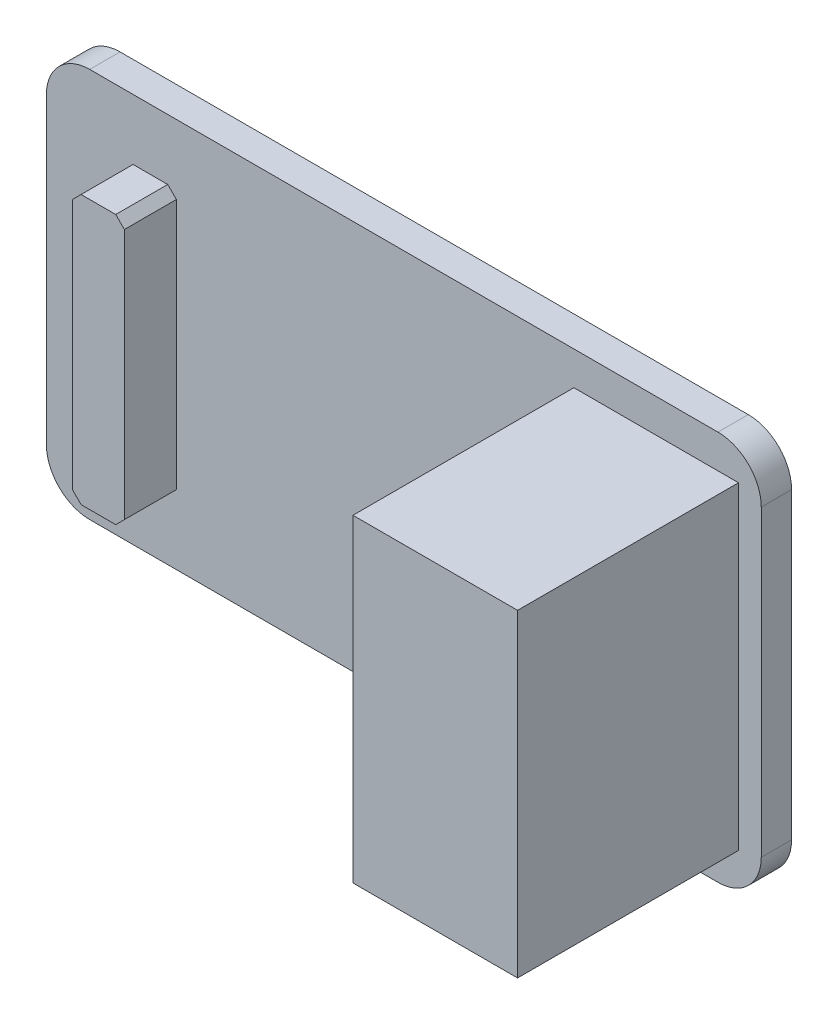
ISO-10303-21;
HEADER;
FILE_DESCRIPTION(('STEP AP214'),'2;1');
FILE_NAME('part.step','',(''),(''),'','','');
FILE_SCHEMA(('AUTOMOTIVE_DESIGN { 1 0 10303 214 1 1 1 1 }'));
ENDSEC;
DATA;
#1=APPLICATION_CONTEXT('core data for automotive mechanical design processes');
#2=APPLICATION_PROTOCOL_DEFINITION('international standard','automotive_design',2000,#1);
#3=PRODUCT_CONTEXT('',#1,'mechanical');
#4=PRODUCT('Part','Part','',(#3));
#5=PRODUCT_RELATED_PRODUCT_CATEGORY('part','',(#4));
#6=PRODUCT_DEFINITION_FORMATION('','',#4);
#7=PRODUCT_DEFINITION_CONTEXT('part definition',#1,'design');
#8=PRODUCT_DEFINITION('design','',#6,#7);
#9=PRODUCT_DEFINITION_SHAPE('','',#8);
#10=(LENGTH_UNIT() NAMED_UNIT(*) SI_UNIT(.MILLI.,.METRE.));
#11=(NAMED_UNIT(*) PLANE_ANGLE_UNIT() SI_UNIT($,.RADIAN.));
#12=(NAMED_UNIT(*) SI_UNIT($,.STERADIAN.) SOLID_ANGLE_UNIT());
#13=UNCERTAINTY_MEASURE_WITH_UNIT(LENGTH_MEASURE(1.E-05),#10,'distance_accuracy_value','');
#14=(GEOMETRIC_REPRESENTATION_CONTEXT(3) GLOBAL_UNCERTAINTY_ASSIGNED_CONTEXT((#13)) GLOBAL_UNIT_ASSIGNED_CONTEXT((#10,
#11,#12)) REPRESENTATION_CONTEXT('',''));
#15=CARTESIAN_POINT('',(0.,0.,0.));
#16=DIRECTION('',(0.,0.,1.));
#17=DIRECTION('',(1.,0.,0.));
#18=AXIS2_PLACEMENT_3D('',#15,#16,#17);
#19=CARTESIAN_POINT('',(2.0000000000002,-52.,0.699999999998851));
#20=DIRECTION('',(5.72375792308882E-13,-5.74263171450686E-13,1.));
#21=DIRECTION('',(1.,0.,-5.72375792308882E-13));
#22=AXIS2_PLACEMENT_3D('',#19,#20,#21);
#23=CYLINDRICAL_SURFACE('',#22,2.00000000000021);
#24=CARTESIAN_POINT('',(2.,-50.,1.4));
#25=CARTESIAN_POINT('',(2.,-50.,0.));
#26=(BOUNDED_CURVE() B_SPLINE_CURVE(1,(#24,#25),.UNSPECIFIED.,.F.,
.F.) B_SPLINE_CURVE_WITH_KNOTS((2,2),(0.,1.4),
.UNSPECIFIED.) CURVE() GEOMETRIC_REPRESENTATION_ITEM() RATIONAL_B_SPLINE_CURVE((1.,1.)) REPRESENTATION_ITEM(''));
#27=CARTESIAN_POINT('',(2.,-50.,1.4));
#28=VERTEX_POINT('',#27);
#29=CARTESIAN_POINT('',(2.,-50.,0.));
#30=VERTEX_POINT('',#29);
#31=EDGE_CURVE('E10',#28,#30,#26,.T.);
#32=ORIENTED_EDGE('',*,*,#31,.T.);
#33=CARTESIAN_POINT('',(2.,-50.,0.));
#34=CARTESIAN_POINT('',(0.,-50.0000000000001,1.14698579168585E-12));
#35=CARTESIAN_POINT('',(0.,-52.,0.));
#36=(BOUNDED_CURVE() B_SPLINE_CURVE(2,(#33,#34,#35),.UNSPECIFIED.,.F.,
.F.) B_SPLINE_CURVE_WITH_KNOTS((3,3),(0.,3.14159265359069),
.UNSPECIFIED.) CURVE() GEOMETRIC_REPRESENTATION_ITEM() RATIONAL_B_SPLINE_CURVE((1.,
0.707106781186604,1.)) REPRESENTATION_ITEM(''));
#37=CARTESIAN_POINT('',(0.,-52.,0.));
#38=VERTEX_POINT('',#37);
#39=EDGE_CURVE('E306',#30,#38,#36,.T.);
#40=ORIENTED_EDGE('',*,*,#39,.T.);
#41=CARTESIAN_POINT('',(0.,-52.,1.4));
#42=CARTESIAN_POINT('',(0.,-52.,0.));
#43=(BOUNDED_CURVE() B_SPLINE_CURVE(1,(#41,#42),.UNSPECIFIED.,.F.,
.F.) B_SPLINE_CURVE_WITH_KNOTS((2,2),(0.,1.4),
.UNSPECIFIED.) CURVE() GEOMETRIC_REPRESENTATION_ITEM() RATIONAL_B_SPLINE_CURVE((1.,1.)) REPRESENTATION_ITEM(''));
#44=CARTESIAN_POINT('',(0.,-52.,1.4));
#45=VERTEX_POINT('',#44);
#46=EDGE_CURVE('E272',#45,#38,#43,.T.);
#47=ORIENTED_EDGE('',*,*,#46,.F.);
#48=CARTESIAN_POINT('',(2.,-50.,1.4));
#49=CARTESIAN_POINT('',(0.,-50.0000000000001,1.40000000000115));
#50=CARTESIAN_POINT('',(0.,-52.,1.4));
#51=(BOUNDED_CURVE() B_SPLINE_CURVE(2,(#48,#49,#50),.UNSPECIFIED.,.F.,
.F.) B_SPLINE_CURVE_WITH_KNOTS((3,3),(0.,3.14159265359069),
.UNSPECIFIED.) CURVE() GEOMETRIC_REPRESENTATION_ITEM() RATIONAL_B_SPLINE_CURVE((1.,
0.707106781186604,1.)) REPRESENTATION_ITEM(''));
#52=EDGE_CURVE('E264',#28,#45,#51,.T.);
#53=ORIENTED_EDGE('',*,*,#52,.F.);
#54=EDGE_LOOP('',(#32,#40,#47,#53));
#55=FACE_BOUND('',#54,.T.);
#56=ADVANCED_FACE('F16',(#55),#23,.T.);
#57=CARTESIAN_POINT('',(31.,-52.,0.699999999998974));
#58=DIRECTION('',(-5.05641515926215E-13,-5.05641515926269E-13,1.));
#59=DIRECTION('',(1.,0.,5.05641515926215E-13));
#60=AXIS2_PLACEMENT_3D('',#57,#58,#59);
#61=CYLINDRICAL_SURFACE('',#60,1.99999999999985);
#62=CARTESIAN_POINT('',(33.,-52.,1.4));
#63=CARTESIAN_POINT('',(33.,-52.,0.));
#64=(BOUNDED_CURVE() B_SPLINE_CURVE(1,(#62,#63),.UNSPECIFIED.,.F.,
.F.) B_SPLINE_CURVE_WITH_KNOTS((2,2),(0.,1.4),
.UNSPECIFIED.) CURVE() GEOMETRIC_REPRESENTATION_ITEM() RATIONAL_B_SPLINE_CURVE((1.,1.)) REPRESENTATION_ITEM(''));
#65=CARTESIAN_POINT('',(33.,-52.,1.4));
#66=VERTEX_POINT('',#65);
#67=CARTESIAN_POINT('',(33.,-52.,0.));
#68=VERTEX_POINT('',#67);
#69=EDGE_CURVE('E296',#66,#68,#64,.T.);
#70=ORIENTED_EDGE('',*,*,#69,.T.);
#71=CARTESIAN_POINT('',(33.,-52.,0.));
#72=CARTESIAN_POINT('',(32.9999999999999,-50.,9.96231667293534E-13));
#73=CARTESIAN_POINT('',(31.,-50.,0.));
#74=(BOUNDED_CURVE() B_SPLINE_CURVE(2,(#71,#72,#73),.UNSPECIFIED.,.F.,
.F.) B_SPLINE_CURVE_WITH_KNOTS((3,3),(0.,3.14159265359029),
.UNSPECIFIED.) CURVE() GEOMETRIC_REPRESENTATION_ITEM() RATIONAL_B_SPLINE_CURVE((1.,
0.707106781186566,1.)) REPRESENTATION_ITEM(''));
#75=CARTESIAN_POINT('',(31.,-50.,0.));
#76=VERTEX_POINT('',#75);
#77=EDGE_CURVE('E305',#68,#76,#74,.T.);
#78=ORIENTED_EDGE('',*,*,#77,.T.);
#79=CARTESIAN_POINT('',(31.,-50.,1.4));
#80=CARTESIAN_POINT('',(31.,-50.,0.));
#81=(BOUNDED_CURVE() B_SPLINE_CURVE(1,(#79,#80),.UNSPECIFIED.,.F.,
.F.) B_SPLINE_CURVE_WITH_KNOTS((2,2),(0.,1.4),
.UNSPECIFIED.) CURVE() GEOMETRIC_REPRESENTATION_ITEM() RATIONAL_B_SPLINE_CURVE((1.,1.)) REPRESENTATION_ITEM(''));
#82=CARTESIAN_POINT('',(31.,-50.,1.4));
#83=VERTEX_POINT('',#82);
#84=EDGE_CURVE('E26',#83,#76,#81,.T.);
#85=ORIENTED_EDGE('',*,*,#84,.F.);
#86=CARTESIAN_POINT('',(33.,-52.,1.4));
#87=CARTESIAN_POINT('',(32.9999999999999,-50.,1.40000000000101));
#88=CARTESIAN_POINT('',(31.,-50.,1.4));
#89=(BOUNDED_CURVE() B_SPLINE_CURVE(2,(#86,#87,#88),.UNSPECIFIED.,.F.,
.F.) B_SPLINE_CURVE_WITH_KNOTS((3,3),(0.,3.14159265359029),
.UNSPECIFIED.) CURVE() GEOMETRIC_REPRESENTATION_ITEM() RATIONAL_B_SPLINE_CURVE((1.,
0.707106781186566,1.)) REPRESENTATION_ITEM(''));
#90=EDGE_CURVE('E435',#66,#83,#89,.T.);
#91=ORIENTED_EDGE('',*,*,#90,.F.);
#92=EDGE_LOOP('',(#70,#78,#85,#91));
#93=FACE_BOUND('',#92,.T.);
#94=ADVANCED_FACE('F771',(#93),#61,.T.);
#95=CARTESIAN_POINT('',(2.00000000000006,-66.,0.7));
#96=DIRECTION('',(0.,0.,-1.));
#97=DIRECTION('',(1.,0.,0.));
#98=AXIS2_PLACEMENT_3D('',#95,#96,#97);
#99=CYLINDRICAL_SURFACE('',#98,2.00000000000006);
#100=CARTESIAN_POINT('',(2.,-68.,0.));
#101=CARTESIAN_POINT('',(2.,-68.,1.4));
#102=(BOUNDED_CURVE() B_SPLINE_CURVE(1,(#100,#101),.UNSPECIFIED.,.F.,
.F.) B_SPLINE_CURVE_WITH_KNOTS((2,2),(0.,1.4),
.UNSPECIFIED.) CURVE() GEOMETRIC_REPRESENTATION_ITEM() RATIONAL_B_SPLINE_CURVE((1.,1.)) REPRESENTATION_ITEM(''));
#103=CARTESIAN_POINT('',(2.,-68.,0.));
#104=VERTEX_POINT('',#103);
#105=CARTESIAN_POINT('',(2.,-68.,1.4));
#106=VERTEX_POINT('',#105);
#107=EDGE_CURVE('E256',#104,#106,#102,.T.);
#108=ORIENTED_EDGE('',*,*,#107,.T.);
#109=CARTESIAN_POINT('',(0.,-66.,1.4));
#110=CARTESIAN_POINT('',(0.,-68.,1.4));
#111=CARTESIAN_POINT('',(2.,-68.,1.4));
#112=(BOUNDED_CURVE() B_SPLINE_CURVE(2,(#109,#110,#111),.UNSPECIFIED.,.F.,
.F.) B_SPLINE_CURVE_WITH_KNOTS((3,3),(-3.14159265359072,0.),
.UNSPECIFIED.) CURVE() GEOMETRIC_REPRESENTATION_ITEM() RATIONAL_B_SPLINE_CURVE((1.,
0.707106781186568,1.)) REPRESENTATION_ITEM(''));
#113=CARTESIAN_POINT('',(0.,-66.,1.4));
#114=VERTEX_POINT('',#113);
#115=EDGE_CURVE('E411',#114,#106,#112,.T.);
#116=ORIENTED_EDGE('',*,*,#115,.F.);
#117=CARTESIAN_POINT('',(0.,-66.,0.));
#118=CARTESIAN_POINT('',(0.,-66.,1.4));
#119=(BOUNDED_CURVE() B_SPLINE_CURVE(1,(#117,#118),.UNSPECIFIED.,.F.,
.F.) B_SPLINE_CURVE_WITH_KNOTS((2,2),(0.,1.4),
.UNSPECIFIED.) CURVE() GEOMETRIC_REPRESENTATION_ITEM() RATIONAL_B_SPLINE_CURVE((1.,1.)) REPRESENTATION_ITEM(''));
#120=CARTESIAN_POINT('',(0.,-66.,0.));
#121=VERTEX_POINT('',#120);
#122=EDGE_CURVE('E347',#121,#114,#119,.T.);
#123=ORIENTED_EDGE('',*,*,#122,.F.);
#124=CARTESIAN_POINT('',(0.,-66.,0.));
#125=CARTESIAN_POINT('',(0.,-68.,0.));
#126=CARTESIAN_POINT('',(2.,-68.,0.));
#127=(BOUNDED_CURVE() B_SPLINE_CURVE(2,(#124,#125,#126),.UNSPECIFIED.,.F.,
.F.) B_SPLINE_CURVE_WITH_KNOTS((3,3),(-3.14159265359072,0.),
.UNSPECIFIED.) CURVE() GEOMETRIC_REPRESENTATION_ITEM() RATIONAL_B_SPLINE_CURVE((1.,
0.707106781186568,1.)) REPRESENTATION_ITEM(''));
#128=EDGE_CURVE('E402',#121,#104,#127,.T.);
#129=ORIENTED_EDGE('',*,*,#128,.T.);
#130=EDGE_LOOP('',(#108,#116,#123,#129));
#131=FACE_BOUND('',#130,.T.);
#132=ADVANCED_FACE('F776',(#131),#99,.T.);
#133=CARTESIAN_POINT('',(31.,-66.,0.700000000002775));
#134=DIRECTION('',(1.38961514147328E-12,-1.38772776233141E-12,1.));
#135=DIRECTION('',(1.,0.,-1.38961514147328E-12));
#136=AXIS2_PLACEMENT_3D('',#133,#134,#135);
#137=CYLINDRICAL_SURFACE('',#136,1.99999999999986);
#138=CARTESIAN_POINT('',(31.,-68.,1.4));
#139=CARTESIAN_POINT('',(31.,-68.,0.));
#140=(BOUNDED_CURVE() B_SPLINE_CURVE(1,(#138,#139),.UNSPECIFIED.,.F.,
.F.) B_SPLINE_CURVE_WITH_KNOTS((2,2),(0.,1.4),
.UNSPECIFIED.) CURVE() GEOMETRIC_REPRESENTATION_ITEM() RATIONAL_B_SPLINE_CURVE((1.,1.)) REPRESENTATION_ITEM(''));
#141=CARTESIAN_POINT('',(31.,-68.,1.4));
#142=VERTEX_POINT('',#141);
#143=CARTESIAN_POINT('',(31.,-68.,0.));
#144=VERTEX_POINT('',#143);
#145=EDGE_CURVE('E131',#142,#144,#140,.T.);
#146=ORIENTED_EDGE('',*,*,#145,.T.);
#147=CARTESIAN_POINT('',(31.,-68.,0.));
#148=CARTESIAN_POINT('',(33.,-68.0000000000001,-2.77447713312269E-12));
#149=CARTESIAN_POINT('',(33.,-66.,0.));
#150=(BOUNDED_CURVE() B_SPLINE_CURVE(2,(#147,#148,#149),.UNSPECIFIED.,.F.,
.F.) B_SPLINE_CURVE_WITH_KNOTS((3,3),(0.,3.14159265359098),
.UNSPECIFIED.) CURVE() GEOMETRIC_REPRESENTATION_ITEM() RATIONAL_B_SPLINE_CURVE((1.,
0.707106781186539,1.)) REPRESENTATION_ITEM(''));
#151=CARTESIAN_POINT('',(33.,-66.,0.));
#152=VERTEX_POINT('',#151);
#153=EDGE_CURVE('E379',#144,#152,#150,.T.);
#154=ORIENTED_EDGE('',*,*,#153,.T.);
#155=CARTESIAN_POINT('',(33.,-66.,1.4));
#156=CARTESIAN_POINT('',(33.,-66.,0.));
#157=(BOUNDED_CURVE() B_SPLINE_CURVE(1,(#155,#156),.UNSPECIFIED.,.F.,
.F.) B_SPLINE_CURVE_WITH_KNOTS((2,2),(0.,1.4),
.UNSPECIFIED.) CURVE() GEOMETRIC_REPRESENTATION_ITEM() RATIONAL_B_SPLINE_CURVE((1.,1.)) REPRESENTATION_ITEM(''));
#158=CARTESIAN_POINT('',(33.,-66.,1.4));
#159=VERTEX_POINT('',#158);
#160=EDGE_CURVE('E141',#159,#152,#157,.T.);
#161=ORIENTED_EDGE('',*,*,#160,.F.);
#162=CARTESIAN_POINT('',(31.,-68.,1.4));
#163=CARTESIAN_POINT('',(33.,-68.,1.39999999999722));
#164=CARTESIAN_POINT('',(33.,-66.,1.4));
#165=(BOUNDED_CURVE() B_SPLINE_CURVE(2,(#162,#163,#164),.UNSPECIFIED.,.F.,
.F.) B_SPLINE_CURVE_WITH_KNOTS((3,3),(0.,3.14159265359098),
.UNSPECIFIED.) CURVE() GEOMETRIC_REPRESENTATION_ITEM() RATIONAL_B_SPLINE_CURVE((1.,
0.707106781186537,1.)) REPRESENTATION_ITEM(''));
#166=EDGE_CURVE('E322',#142,#159,#165,.T.);
#167=ORIENTED_EDGE('',*,*,#166,.F.);
#168=EDGE_LOOP('',(#146,#154,#161,#167));
#169=FACE_BOUND('',#168,.T.);
#170=ADVANCED_FACE('F810',(#169),#137,.T.);
#171=CARTESIAN_POINT('',(33.,-50.,0.));
#172=DIRECTION('',(0.,1.,0.));
#173=DIRECTION('',(1.,0.,0.));
#174=AXIS2_PLACEMENT_3D('',#171,#172,#173);
#175=PLANE('',#174);
#176=ORIENTED_EDGE('',*,*,#84,.T.);
#177=CARTESIAN_POINT('',(31.,-50.,0.));
#178=CARTESIAN_POINT('',(2.,-50.,0.));
#179=(BOUNDED_CURVE() B_SPLINE_CURVE(1,(#177,#178),.UNSPECIFIED.,.F.,
.F.) B_SPLINE_CURVE_WITH_KNOTS((2,2),(53.,82.),
.UNSPECIFIED.) CURVE() GEOMETRIC_REPRESENTATION_ITEM() RATIONAL_B_SPLINE_CURVE((1.,1.)) REPRESENTATION_ITEM(''));
#180=EDGE_CURVE('E297',#76,#30,#179,.T.);
#181=ORIENTED_EDGE('',*,*,#180,.T.);
#182=ORIENTED_EDGE('',*,*,#31,.F.);
#183=CARTESIAN_POINT('',(31.,-50.,1.4));
#184=CARTESIAN_POINT('',(2.,-50.,1.4));
#185=(BOUNDED_CURVE() B_SPLINE_CURVE(1,(#183,#184),.UNSPECIFIED.,.F.,
.F.) B_SPLINE_CURVE_WITH_KNOTS((2,2),(53.,82.),
.UNSPECIFIED.) CURVE() GEOMETRIC_REPRESENTATION_ITEM() RATIONAL_B_SPLINE_CURVE((1.,1.)) REPRESENTATION_ITEM(''));
#186=EDGE_CURVE('E436',#83,#28,#185,.T.);
#187=ORIENTED_EDGE('',*,*,#186,.F.);
#188=EDGE_LOOP('',(#176,#181,#182,#187));
#189=FACE_BOUND('',#188,.T.);
#190=ADVANCED_FACE('F781',(#189),#175,.T.);
#191=CARTESIAN_POINT('',(33.,-68.,0.));
#192=DIRECTION('',(1.,0.,0.));
#193=DIRECTION('',(0.,1.,0.));
#194=AXIS2_PLACEMENT_3D('',#191,#192,#193);
#195=PLANE('',#194);
#196=ORIENTED_EDGE('',*,*,#160,.T.);
#197=CARTESIAN_POINT('',(33.,-66.,0.));
#198=CARTESIAN_POINT('',(33.,-52.,0.));
#199=(BOUNDED_CURVE() B_SPLINE_CURVE(1,(#197,#198),.UNSPECIFIED.,.F.,
.F.) B_SPLINE_CURVE_WITH_KNOTS((2,2),(35.,49.),
.UNSPECIFIED.) CURVE() GEOMETRIC_REPRESENTATION_ITEM() RATIONAL_B_SPLINE_CURVE((1.,1.)) REPRESENTATION_ITEM(''));
#200=EDGE_CURVE('E370',#152,#68,#199,.T.);
#201=ORIENTED_EDGE('',*,*,#200,.T.);
#202=ORIENTED_EDGE('',*,*,#69,.F.);
#203=CARTESIAN_POINT('',(33.,-66.,1.4));
#204=CARTESIAN_POINT('',(33.,-52.,1.4));
#205=(BOUNDED_CURVE() B_SPLINE_CURVE(1,(#203,#204),.UNSPECIFIED.,.F.,
.F.) B_SPLINE_CURVE_WITH_KNOTS((2,2),(35.,49.),
.UNSPECIFIED.) CURVE() GEOMETRIC_REPRESENTATION_ITEM() RATIONAL_B_SPLINE_CURVE((1.,1.)) REPRESENTATION_ITEM(''));
#206=EDGE_CURVE('E330',#159,#66,#205,.T.);
#207=ORIENTED_EDGE('',*,*,#206,.F.);
#208=EDGE_LOOP('',(#196,#201,#202,#207));
#209=FACE_BOUND('',#208,.T.);
#210=ADVANCED_FACE('F799',(#209),#195,.T.);
#211=CARTESIAN_POINT('',(0.,-68.,0.));
#212=DIRECTION('',(0.,-1.,0.));
#213=DIRECTION('',(0.,0.,-1.));
#214=AXIS2_PLACEMENT_3D('',#211,#212,#213);
#215=PLANE('',#214);
#216=CARTESIAN_POINT('',(2.,-68.,1.4));
#217=CARTESIAN_POINT('',(31.,-68.,1.4));
#218=(BOUNDED_CURVE() B_SPLINE_CURVE(1,(#216,#217),.UNSPECIFIED.,.F.,
.F.) B_SPLINE_CURVE_WITH_KNOTS((2,2),(2.,31.),
.UNSPECIFIED.) CURVE() GEOMETRIC_REPRESENTATION_ITEM() RATIONAL_B_SPLINE_CURVE((1.,1.)) REPRESENTATION_ITEM(''));
#219=EDGE_CURVE('E331',#106,#142,#218,.T.);
#220=ORIENTED_EDGE('',*,*,#219,.F.);
#221=ORIENTED_EDGE('',*,*,#107,.F.);
#222=CARTESIAN_POINT('',(2.,-68.,0.));
#223=CARTESIAN_POINT('',(31.,-68.,0.));
#224=(BOUNDED_CURVE() B_SPLINE_CURVE(1,(#222,#223),.UNSPECIFIED.,.F.,
.F.) B_SPLINE_CURVE_WITH_KNOTS((2,2),(2.,31.),
.UNSPECIFIED.) CURVE() GEOMETRIC_REPRESENTATION_ITEM() RATIONAL_B_SPLINE_CURVE((1.,1.)) REPRESENTATION_ITEM(''));
#225=EDGE_CURVE('E394',#104,#144,#224,.T.);
#226=ORIENTED_EDGE('',*,*,#225,.T.);
#227=ORIENTED_EDGE('',*,*,#145,.F.);
#228=EDGE_LOOP('',(#220,#221,#226,#227));
#229=FACE_BOUND('',#228,.T.);
#230=ADVANCED_FACE('F797',(#229),#215,.T.);
#231=CARTESIAN_POINT('',(0.,-68.,1.4));
#232=DIRECTION('',(0.,0.,1.));
#233=DIRECTION('',(1.,0.,0.));
#234=AXIS2_PLACEMENT_3D('',#231,#232,#233);
#235=PLANE('',#234);
#236=CARTESIAN_POINT('',(6.,-53.2,1.4));
#237=CARTESIAN_POINT('',(5.6,-52.8,1.4));
#238=(BOUNDED_CURVE() B_SPLINE_CURVE(1,(#236,#237),.UNSPECIFIED.,.F.,
.F.) B_SPLINE_CURVE_WITH_KNOTS((2,2),(0.,0.565685424949325),
.UNSPECIFIED.) CURVE() GEOMETRIC_REPRESENTATION_ITEM() RATIONAL_B_SPLINE_CURVE((1.,1.)) REPRESENTATION_ITEM(''));
#239=CARTESIAN_POINT('',(6.,-53.2,1.4));
#240=VERTEX_POINT('',#239);
#241=CARTESIAN_POINT('',(5.6,-52.8,1.4));
#242=VERTEX_POINT('',#241);
#243=EDGE_CURVE('E177',#240,#242,#238,.T.);
#244=ORIENTED_EDGE('',*,*,#243,.F.);
#245=CARTESIAN_POINT('',(6.,-64.8,1.4));
#246=CARTESIAN_POINT('',(6.,-53.2,1.4));
#247=(BOUNDED_CURVE() B_SPLINE_CURVE(1,(#245,#246),.UNSPECIFIED.,.F.,
.F.) B_SPLINE_CURVE_WITH_KNOTS((2,2),(15.2,26.8),
.UNSPECIFIED.) CURVE() GEOMETRIC_REPRESENTATION_ITEM() RATIONAL_B_SPLINE_CURVE((1.,1.)) REPRESENTATION_ITEM(''));
#248=CARTESIAN_POINT('',(6.,-64.8,1.4));
#249=VERTEX_POINT('',#248);
#250=EDGE_CURVE('E588',#249,#240,#247,.T.);
#251=ORIENTED_EDGE('',*,*,#250,.F.);
#252=CARTESIAN_POINT('',(5.6,-65.2,1.4));
#253=CARTESIAN_POINT('',(6.,-64.8,1.4));
#254=(BOUNDED_CURVE() B_SPLINE_CURVE(1,(#252,#253),.UNSPECIFIED.,.F.,
.F.) B_SPLINE_CURVE_WITH_KNOTS((2,2),(0.,0.565685424949355),
.UNSPECIFIED.) CURVE() GEOMETRIC_REPRESENTATION_ITEM() RATIONAL_B_SPLINE_CURVE((1.,1.)) REPRESENTATION_ITEM(''));
#255=CARTESIAN_POINT('',(5.6,-65.2,1.4));
#256=VERTEX_POINT('',#255);
#257=EDGE_CURVE('E220',#256,#249,#254,.T.);
#258=ORIENTED_EDGE('',*,*,#257,.F.);
#259=CARTESIAN_POINT('',(4.,-65.2,1.4));
#260=CARTESIAN_POINT('',(5.6,-65.2,1.4));
#261=(BOUNDED_CURVE() B_SPLINE_CURVE(1,(#259,#260),.UNSPECIFIED.,.F.,
.F.) B_SPLINE_CURVE_WITH_KNOTS((2,2),(12.8,14.4),
.UNSPECIFIED.) CURVE() GEOMETRIC_REPRESENTATION_ITEM() RATIONAL_B_SPLINE_CURVE((1.,1.)) REPRESENTATION_ITEM(''));
#262=CARTESIAN_POINT('',(4.,-65.2,1.4));
#263=VERTEX_POINT('',#262);
#264=EDGE_CURVE('E554',#263,#256,#261,.T.);
#265=ORIENTED_EDGE('',*,*,#264,.F.);
#266=CARTESIAN_POINT('',(3.6,-64.8,1.4));
#267=CARTESIAN_POINT('',(4.,-65.2,1.4));
#268=(BOUNDED_CURVE() B_SPLINE_CURVE(1,(#266,#267),.UNSPECIFIED.,.F.,
.F.) B_SPLINE_CURVE_WITH_KNOTS((2,2),(0.,0.565685424949222),
.UNSPECIFIED.) CURVE() GEOMETRIC_REPRESENTATION_ITEM() RATIONAL_B_SPLINE_CURVE((1.,1.)) REPRESENTATION_ITEM(''));
#269=CARTESIAN_POINT('',(3.6,-64.8,1.4));
#270=VERTEX_POINT('',#269);
#271=EDGE_CURVE('E605',#270,#263,#268,.T.);
#272=ORIENTED_EDGE('',*,*,#271,.F.);
#273=CARTESIAN_POINT('',(3.6,-53.2,1.4));
#274=CARTESIAN_POINT('',(3.6,-64.8,1.4));
#275=(BOUNDED_CURVE() B_SPLINE_CURVE(1,(#273,#274),.UNSPECIFIED.,.F.,
.F.) B_SPLINE_CURVE_WITH_KNOTS((2,2),(0.400000000000006,12.),
.UNSPECIFIED.) CURVE() GEOMETRIC_REPRESENTATION_ITEM() RATIONAL_B_SPLINE_CURVE((1.,1.)) REPRESENTATION_ITEM(''));
#276=CARTESIAN_POINT('',(3.6,-53.2,1.4));
#277=VERTEX_POINT('',#276);
#278=EDGE_CURVE('E473',#277,#270,#275,.T.);
#279=ORIENTED_EDGE('',*,*,#278,.F.);
#280=CARTESIAN_POINT('',(4.,-52.8,1.4));
#281=CARTESIAN_POINT('',(3.6,-53.2,1.4));
#282=(BOUNDED_CURVE() B_SPLINE_CURVE(1,(#280,#281),.UNSPECIFIED.,.F.,
.F.) B_SPLINE_CURVE_WITH_KNOTS((2,2),(-0.565685424949267,0.),
.UNSPECIFIED.) CURVE() GEOMETRIC_REPRESENTATION_ITEM() RATIONAL_B_SPLINE_CURVE((1.,1.)) REPRESENTATION_ITEM(''));
#283=CARTESIAN_POINT('',(4.,-52.8,1.4));
#284=VERTEX_POINT('',#283);
#285=EDGE_CURVE('E613',#284,#277,#282,.T.);
#286=ORIENTED_EDGE('',*,*,#285,.F.);
#287=CARTESIAN_POINT('',(5.6,-52.8,1.4));
#288=CARTESIAN_POINT('',(4.,-52.8,1.4));
#289=(BOUNDED_CURVE() B_SPLINE_CURVE(1,(#287,#288),.UNSPECIFIED.,.F.,
.F.) B_SPLINE_CURVE_WITH_KNOTS((2,2),(27.6,29.2),
.UNSPECIFIED.) CURVE() GEOMETRIC_REPRESENTATION_ITEM() RATIONAL_B_SPLINE_CURVE((1.,1.)) REPRESENTATION_ITEM(''));
#290=EDGE_CURVE('E674',#242,#284,#289,.T.);
#291=ORIENTED_EDGE('',*,*,#290,.F.);
#292=EDGE_LOOP('',(#244,#251,#258,#265,#272,#279,#286,#291));
#293=FACE_BOUND('',#292,.T.);
#294=CARTESIAN_POINT('',(24.35,-66.25,1.4));
#295=CARTESIAN_POINT('',(31.95,-66.25,1.4));
#296=(BOUNDED_CURVE() B_SPLINE_CURVE(1,(#294,#295),.UNSPECIFIED.,.F.,
.F.) B_SPLINE_CURVE_WITH_KNOTS((2,2),(37.,44.6),
.UNSPECIFIED.) CURVE() GEOMETRIC_REPRESENTATION_ITEM() RATIONAL_B_SPLINE_CURVE((1.,1.)) REPRESENTATION_ITEM(''));
#297=CARTESIAN_POINT('',(24.35,-66.25,1.4));
#298=VERTEX_POINT('',#297);
#299=CARTESIAN_POINT('',(31.95,-66.25,1.4));
#300=VERTEX_POINT('',#299);
#301=EDGE_CURVE('E184',#298,#300,#296,.T.);
#302=ORIENTED_EDGE('',*,*,#301,.F.);
#303=CARTESIAN_POINT('',(24.35,-51.55,1.4));
#304=CARTESIAN_POINT('',(24.35,-66.25,1.4));
#305=(BOUNDED_CURVE() B_SPLINE_CURVE(1,(#303,#304),.UNSPECIFIED.,.F.,
.F.) B_SPLINE_CURVE_WITH_KNOTS((2,2),(22.3,37.),
.UNSPECIFIED.) CURVE() GEOMETRIC_REPRESENTATION_ITEM() RATIONAL_B_SPLINE_CURVE((1.,1.)) REPRESENTATION_ITEM(''));
#306=CARTESIAN_POINT('',(24.35,-51.55,1.4));
#307=VERTEX_POINT('',#306);
#308=EDGE_CURVE('E281',#307,#298,#305,.T.);
#309=ORIENTED_EDGE('',*,*,#308,.F.);
#310=CARTESIAN_POINT('',(31.95,-51.55,1.4));
#311=CARTESIAN_POINT('',(24.35,-51.55,1.4));
#312=(BOUNDED_CURVE() B_SPLINE_CURVE(1,(#310,#311),.UNSPECIFIED.,.F.,
.F.) B_SPLINE_CURVE_WITH_KNOTS((2,2),(14.7,22.3),
.UNSPECIFIED.) CURVE() GEOMETRIC_REPRESENTATION_ITEM() RATIONAL_B_SPLINE_CURVE((1.,1.)) REPRESENTATION_ITEM(''));
#313=CARTESIAN_POINT('',(31.95,-51.55,1.4));
#314=VERTEX_POINT('',#313);
#315=EDGE_CURVE('E206',#314,#307,#312,.T.);
#316=ORIENTED_EDGE('',*,*,#315,.F.);
#317=CARTESIAN_POINT('',(31.95,-66.25,1.4));
#318=CARTESIAN_POINT('',(31.95,-51.55,1.4));
#319=(BOUNDED_CURVE() B_SPLINE_CURVE(1,(#317,#318),.UNSPECIFIED.,.F.,
.F.) B_SPLINE_CURVE_WITH_KNOTS((2,2),(0.,14.7),
.UNSPECIFIED.) CURVE() GEOMETRIC_REPRESENTATION_ITEM() RATIONAL_B_SPLINE_CURVE((1.,1.)) REPRESENTATION_ITEM(''));
#320=EDGE_CURVE('E202',#300,#314,#319,.T.);
#321=ORIENTED_EDGE('',*,*,#320,.F.);
#322=EDGE_LOOP('',(#302,#309,#316,#321));
#323=FACE_BOUND('',#322,.T.);
#324=CARTESIAN_POINT('',(0.,-52.,1.4));
#325=CARTESIAN_POINT('',(0.,-66.,1.4));
#326=(BOUNDED_CURVE() B_SPLINE_CURVE(1,(#324,#325),.UNSPECIFIED.,.F.,
.F.) B_SPLINE_CURVE_WITH_KNOTS((2,2),(86.,100.),
.UNSPECIFIED.) CURVE() GEOMETRIC_REPRESENTATION_ITEM() RATIONAL_B_SPLINE_CURVE((1.,1.)) REPRESENTATION_ITEM(''));
#327=EDGE_CURVE('E225',#45,#114,#326,.T.);
#328=ORIENTED_EDGE('',*,*,#327,.T.);
#329=ORIENTED_EDGE('',*,*,#115,.T.);
#330=ORIENTED_EDGE('',*,*,#219,.T.);
#331=ORIENTED_EDGE('',*,*,#166,.T.);
#332=ORIENTED_EDGE('',*,*,#206,.T.);
#333=ORIENTED_EDGE('',*,*,#90,.T.);
#334=ORIENTED_EDGE('',*,*,#186,.T.);
#335=ORIENTED_EDGE('',*,*,#52,.T.);
#336=EDGE_LOOP('',(#328,#329,#330,#331,#332,#333,#334,#335));
#337=FACE_BOUND('',#336,.T.);
#338=ADVANCED_FACE('F208',(#293,#323,#337),#235,.T.);
#339=CARTESIAN_POINT('',(0.,-68.,0.));
#340=DIRECTION('',(0.,0.,-1.));
#341=DIRECTION('',(0.,-1.,0.));
#342=AXIS2_PLACEMENT_3D('',#339,#340,#341);
#343=PLANE('',#342);
#344=ORIENTED_EDGE('',*,*,#39,.F.);
#345=ORIENTED_EDGE('',*,*,#180,.F.);
#346=ORIENTED_EDGE('',*,*,#77,.F.);
#347=ORIENTED_EDGE('',*,*,#200,.F.);
#348=ORIENTED_EDGE('',*,*,#153,.F.);
#349=ORIENTED_EDGE('',*,*,#225,.F.);
#350=ORIENTED_EDGE('',*,*,#128,.F.);
#351=CARTESIAN_POINT('',(0.,-52.,0.));
#352=CARTESIAN_POINT('',(0.,-66.,0.));
#353=(BOUNDED_CURVE() B_SPLINE_CURVE(1,(#351,#352),.UNSPECIFIED.,.F.,
.F.) B_SPLINE_CURVE_WITH_KNOTS((2,2),(86.,100.),
.UNSPECIFIED.) CURVE() GEOMETRIC_REPRESENTATION_ITEM() RATIONAL_B_SPLINE_CURVE((1.,1.)) REPRESENTATION_ITEM(''));
#354=EDGE_CURVE('E338',#38,#121,#353,.T.);
#355=ORIENTED_EDGE('',*,*,#354,.F.);
#356=EDGE_LOOP('',(#344,#345,#346,#347,#348,#349,#350,#355));
#357=FACE_BOUND('',#356,.T.);
#358=ADVANCED_FACE('F784',(#357),#343,.T.);
#359=CARTESIAN_POINT('',(0.,-50.,0.));
#360=DIRECTION('',(-1.,0.,0.));
#361=DIRECTION('',(0.,0.,1.));
#362=AXIS2_PLACEMENT_3D('',#359,#360,#361);
#363=PLANE('',#362);
#364=ORIENTED_EDGE('',*,*,#46,.T.);
#365=ORIENTED_EDGE('',*,*,#354,.T.);
#366=ORIENTED_EDGE('',*,*,#122,.T.);
#367=ORIENTED_EDGE('',*,*,#327,.F.);
#368=EDGE_LOOP('',(#364,#365,#366,#367));
#369=FACE_BOUND('',#368,.T.);
#370=ADVANCED_FACE('F789',(#369),#363,.T.);
#371=CARTESIAN_POINT('',(31.95,-66.25,11.6));
#372=DIRECTION('',(0.,0.,1.));
#373=DIRECTION('',(1.,0.,0.));
#374=AXIS2_PLACEMENT_3D('',#371,#372,#373);
#375=PLANE('',#374);
#376=CARTESIAN_POINT('',(31.95,-66.25,11.6));
#377=CARTESIAN_POINT('',(31.95,-51.55,11.6));
#378=(BOUNDED_CURVE() B_SPLINE_CURVE(1,(#376,#377),.UNSPECIFIED.,.F.,
.F.) B_SPLINE_CURVE_WITH_KNOTS((2,2),(0.,14.7),
.UNSPECIFIED.) CURVE() GEOMETRIC_REPRESENTATION_ITEM() RATIONAL_B_SPLINE_CURVE((1.,1.)) REPRESENTATION_ITEM(''));
#379=CARTESIAN_POINT('',(31.95,-66.25,11.6));
#380=VERTEX_POINT('',#379);
#381=CARTESIAN_POINT('',(31.95,-51.55,11.6));
#382=VERTEX_POINT('',#381);
#383=EDGE_CURVE('E204',#380,#382,#378,.T.);
#384=ORIENTED_EDGE('',*,*,#383,.T.);
#385=CARTESIAN_POINT('',(31.95,-51.55,11.6));
#386=CARTESIAN_POINT('',(24.35,-51.55,11.6));
#387=(BOUNDED_CURVE() B_SPLINE_CURVE(1,(#385,#386),.UNSPECIFIED.,.F.,
.F.) B_SPLINE_CURVE_WITH_KNOTS((2,2),(14.7,22.3),
.UNSPECIFIED.) CURVE() GEOMETRIC_REPRESENTATION_ITEM() RATIONAL_B_SPLINE_CURVE((1.,1.)) REPRESENTATION_ITEM(''));
#388=CARTESIAN_POINT('',(24.35,-51.55,11.6));
#389=VERTEX_POINT('',#388);
#390=EDGE_CURVE('E255',#382,#389,#387,.T.);
#391=ORIENTED_EDGE('',*,*,#390,.T.);
#392=CARTESIAN_POINT('',(24.35,-51.55,11.6));
#393=CARTESIAN_POINT('',(24.35,-66.25,11.6));
#394=(BOUNDED_CURVE() B_SPLINE_CURVE(1,(#392,#393),.UNSPECIFIED.,.F.,
.F.) B_SPLINE_CURVE_WITH_KNOTS((2,2),(22.3,37.),
.UNSPECIFIED.) CURVE() GEOMETRIC_REPRESENTATION_ITEM() RATIONAL_B_SPLINE_CURVE((1.,1.)) REPRESENTATION_ITEM(''));
#395=CARTESIAN_POINT('',(24.35,-66.25,11.6));
#396=VERTEX_POINT('',#395);
#397=EDGE_CURVE('E196',#389,#396,#394,.T.);
#398=ORIENTED_EDGE('',*,*,#397,.T.);
#399=CARTESIAN_POINT('',(24.35,-66.25,11.6));
#400=CARTESIAN_POINT('',(31.95,-66.25,11.6));
#401=(BOUNDED_CURVE() B_SPLINE_CURVE(1,(#399,#400),.UNSPECIFIED.,.F.,
.F.) B_SPLINE_CURVE_WITH_KNOTS((2,2),(37.,44.6),
.UNSPECIFIED.) CURVE() GEOMETRIC_REPRESENTATION_ITEM() RATIONAL_B_SPLINE_CURVE((1.,1.)) REPRESENTATION_ITEM(''));
#402=EDGE_CURVE('E195',#396,#380,#401,.T.);
#403=ORIENTED_EDGE('',*,*,#402,.T.);
#404=EDGE_LOOP('',(#384,#391,#398,#403));
#405=FACE_BOUND('',#404,.T.);
#406=ADVANCED_FACE('F871',(#405),#375,.T.);
#407=CARTESIAN_POINT('',(24.35,-66.25,1.4));
#408=DIRECTION('',(0.,-1.,0.));
#409=DIRECTION('',(0.,0.,-1.));
#410=AXIS2_PLACEMENT_3D('',#407,#408,#409);
#411=PLANE('',#410);
#412=ORIENTED_EDGE('',*,*,#301,.T.);
#413=CARTESIAN_POINT('',(31.95,-66.25,1.4));
#414=CARTESIAN_POINT('',(31.95,-66.25,11.6));
#415=(BOUNDED_CURVE() B_SPLINE_CURVE(1,(#413,#414),.UNSPECIFIED.,.F.,
.F.) B_SPLINE_CURVE_WITH_KNOTS((2,2),(0.,10.2),
.UNSPECIFIED.) CURVE() GEOMETRIC_REPRESENTATION_ITEM() RATIONAL_B_SPLINE_CURVE((1.,1.)) REPRESENTATION_ITEM(''));
#416=EDGE_CURVE('E187',#300,#380,#415,.T.);
#417=ORIENTED_EDGE('',*,*,#416,.T.);
#418=ORIENTED_EDGE('',*,*,#402,.F.);
#419=CARTESIAN_POINT('',(24.35,-66.25,1.4));
#420=CARTESIAN_POINT('',(24.35,-66.25,11.6));
#421=(BOUNDED_CURVE() B_SPLINE_CURVE(1,(#419,#420),.UNSPECIFIED.,.F.,
.F.) B_SPLINE_CURVE_WITH_KNOTS((2,2),(0.,10.2),
.UNSPECIFIED.) CURVE() GEOMETRIC_REPRESENTATION_ITEM() RATIONAL_B_SPLINE_CURVE((1.,1.)) REPRESENTATION_ITEM(''));
#422=EDGE_CURVE('E190',#298,#396,#421,.T.);
#423=ORIENTED_EDGE('',*,*,#422,.F.);
#424=EDGE_LOOP('',(#412,#417,#418,#423));
#425=FACE_BOUND('',#424,.T.);
#426=ADVANCED_FACE('F186',(#425),#411,.T.);
#427=CARTESIAN_POINT('',(24.35,-51.55,1.4));
#428=DIRECTION('',(-1.,0.,0.));
#429=DIRECTION('',(0.,0.,1.));
#430=AXIS2_PLACEMENT_3D('',#427,#428,#429);
#431=PLANE('',#430);
#432=ORIENTED_EDGE('',*,*,#308,.T.);
#433=ORIENTED_EDGE('',*,*,#422,.T.);
#434=ORIENTED_EDGE('',*,*,#397,.F.);
#435=CARTESIAN_POINT('',(24.35,-51.55,1.4));
#436=CARTESIAN_POINT('',(24.35,-51.55,11.6));
#437=(BOUNDED_CURVE() B_SPLINE_CURVE(1,(#435,#436),.UNSPECIFIED.,.F.,
.F.) B_SPLINE_CURVE_WITH_KNOTS((2,2),(0.,10.2),
.UNSPECIFIED.) CURVE() GEOMETRIC_REPRESENTATION_ITEM() RATIONAL_B_SPLINE_CURVE((1.,1.)) REPRESENTATION_ITEM(''));
#438=EDGE_CURVE('E246',#307,#389,#437,.T.);
#439=ORIENTED_EDGE('',*,*,#438,.F.);
#440=EDGE_LOOP('',(#432,#433,#434,#439));
#441=FACE_BOUND('',#440,.T.);
#442=ADVANCED_FACE('F889',(#441),#431,.T.);
#443=CARTESIAN_POINT('',(31.95,-51.55,1.4));
#444=DIRECTION('',(0.,1.,0.));
#445=DIRECTION('',(1.,0.,0.));
#446=AXIS2_PLACEMENT_3D('',#443,#444,#445);
#447=PLANE('',#446);
#448=ORIENTED_EDGE('',*,*,#315,.T.);
#449=ORIENTED_EDGE('',*,*,#438,.T.);
#450=ORIENTED_EDGE('',*,*,#390,.F.);
#451=CARTESIAN_POINT('',(31.95,-51.55,1.4));
#452=CARTESIAN_POINT('',(31.95,-51.55,11.6));
#453=(BOUNDED_CURVE() B_SPLINE_CURVE(1,(#451,#452),.UNSPECIFIED.,.F.,
.F.) B_SPLINE_CURVE_WITH_KNOTS((2,2),(0.,10.2),
.UNSPECIFIED.) CURVE() GEOMETRIC_REPRESENTATION_ITEM() RATIONAL_B_SPLINE_CURVE((1.,1.)) REPRESENTATION_ITEM(''));
#454=EDGE_CURVE('E213',#314,#382,#453,.T.);
#455=ORIENTED_EDGE('',*,*,#454,.F.);
#456=EDGE_LOOP('',(#448,#449,#450,#455));
#457=FACE_BOUND('',#456,.T.);
#458=ADVANCED_FACE('F899',(#457),#447,.T.);
#459=CARTESIAN_POINT('',(31.95,-66.25,1.4));
#460=DIRECTION('',(1.,0.,0.));
#461=DIRECTION('',(0.,1.,0.));
#462=AXIS2_PLACEMENT_3D('',#459,#460,#461);
#463=PLANE('',#462);
#464=ORIENTED_EDGE('',*,*,#320,.T.);
#465=ORIENTED_EDGE('',*,*,#454,.T.);
#466=ORIENTED_EDGE('',*,*,#383,.F.);
#467=ORIENTED_EDGE('',*,*,#416,.F.);
#468=EDGE_LOOP('',(#464,#465,#466,#467));
#469=FACE_BOUND('',#468,.T.);
#470=ADVANCED_FACE('F200',(#469),#463,.T.);
#471=CARTESIAN_POINT('',(6.,-53.2,4.2));
#472=DIRECTION('',(0.707106781186627,0.707106781186468,0.));
#473=DIRECTION('',(0.,0.,-1.));
#474=AXIS2_PLACEMENT_3D('',#471,#472,#473);
#475=PLANE('',#474);
#476=CARTESIAN_POINT('',(6.,-53.2,3.8));
#477=CARTESIAN_POINT('',(6.,-53.2,1.4));
#478=(BOUNDED_CURVE() B_SPLINE_CURVE(1,(#476,#477),.UNSPECIFIED.,.F.,
.F.) B_SPLINE_CURVE_WITH_KNOTS((2,2),(0.,2.4),
.UNSPECIFIED.) CURVE() GEOMETRIC_REPRESENTATION_ITEM() RATIONAL_B_SPLINE_CURVE((1.,1.)) REPRESENTATION_ITEM(''));
#479=CARTESIAN_POINT('',(6.,-53.2,3.8));
#480=VERTEX_POINT('',#479);
#481=EDGE_CURVE('E597',#480,#240,#478,.T.);
#482=ORIENTED_EDGE('',*,*,#481,.T.);
#483=ORIENTED_EDGE('',*,*,#243,.T.);
#484=CARTESIAN_POINT('',(5.6,-52.8,3.8));
#485=CARTESIAN_POINT('',(5.6,-52.8,1.4));
#486=(BOUNDED_CURVE() B_SPLINE_CURVE(1,(#484,#485),.UNSPECIFIED.,.F.,
.F.) B_SPLINE_CURVE_WITH_KNOTS((2,2),(0.,2.4),
.UNSPECIFIED.) CURVE() GEOMETRIC_REPRESENTATION_ITEM() RATIONAL_B_SPLINE_CURVE((1.,1.)) REPRESENTATION_ITEM(''));
#487=CARTESIAN_POINT('',(5.6,-52.8,3.8));
#488=VERTEX_POINT('',#487);
#489=EDGE_CURVE('E682',#488,#242,#486,.T.);
#490=ORIENTED_EDGE('',*,*,#489,.F.);
#491=CARTESIAN_POINT('',(6.,-53.2,3.8));
#492=CARTESIAN_POINT('',(5.6,-52.8,3.8));
#493=(BOUNDED_CURVE() B_SPLINE_CURVE(1,(#491,#492),.UNSPECIFIED.,.F.,
.F.) B_SPLINE_CURVE_WITH_KNOTS((2,2),(0.,0.565685424949325),
.UNSPECIFIED.) CURVE() GEOMETRIC_REPRESENTATION_ITEM() RATIONAL_B_SPLINE_CURVE((1.,1.)) REPRESENTATION_ITEM(''));
#494=EDGE_CURVE('E510',#480,#488,#493,.T.);
#495=ORIENTED_EDGE('',*,*,#494,.F.);
#496=EDGE_LOOP('',(#482,#483,#490,#495));
#497=FACE_BOUND('',#496,.T.);
#498=ADVANCED_FACE('F720',(#497),#475,.T.);
#499=CARTESIAN_POINT('',(5.6,-65.2,4.2));
#500=DIRECTION('',(0.707106781186633,-0.707106781186462,0.));
#501=DIRECTION('',(0.,0.,-1.));
#502=AXIS2_PLACEMENT_3D('',#499,#500,#501);
#503=PLANE('',#502);
#504=CARTESIAN_POINT('',(5.6,-65.2,3.8));
#505=CARTESIAN_POINT('',(5.6,-65.2,1.4));
#506=(BOUNDED_CURVE() B_SPLINE_CURVE(1,(#504,#505),.UNSPECIFIED.,.F.,
.F.) B_SPLINE_CURVE_WITH_KNOTS((2,2),(0.,2.4),
.UNSPECIFIED.) CURVE() GEOMETRIC_REPRESENTATION_ITEM() RATIONAL_B_SPLINE_CURVE((1.,1.)) REPRESENTATION_ITEM(''));
#507=CARTESIAN_POINT('',(5.6,-65.2,3.8));
#508=VERTEX_POINT('',#507);
#509=EDGE_CURVE('E563',#508,#256,#506,.T.);
#510=ORIENTED_EDGE('',*,*,#509,.T.);
#511=ORIENTED_EDGE('',*,*,#257,.T.);
#512=CARTESIAN_POINT('',(6.,-64.8,3.8));
#513=CARTESIAN_POINT('',(6.,-64.8,1.4));
#514=(BOUNDED_CURVE() B_SPLINE_CURVE(1,(#512,#513),.UNSPECIFIED.,.F.,
.F.) B_SPLINE_CURVE_WITH_KNOTS((2,2),(0.,2.4),
.UNSPECIFIED.) CURVE() GEOMETRIC_REPRESENTATION_ITEM() RATIONAL_B_SPLINE_CURVE((1.,1.)) REPRESENTATION_ITEM(''));
#515=CARTESIAN_POINT('',(6.,-64.8,3.8));
#516=VERTEX_POINT('',#515);
#517=EDGE_CURVE('E572',#516,#249,#514,.T.);
#518=ORIENTED_EDGE('',*,*,#517,.F.);
#519=CARTESIAN_POINT('',(5.6,-65.2,3.8));
#520=CARTESIAN_POINT('',(6.,-64.8,3.8));
#521=(BOUNDED_CURVE() B_SPLINE_CURVE(1,(#519,#520),.UNSPECIFIED.,.F.,
.F.) B_SPLINE_CURVE_WITH_KNOTS((2,2),(0.,0.565685424949355),
.UNSPECIFIED.) CURVE() GEOMETRIC_REPRESENTATION_ITEM() RATIONAL_B_SPLINE_CURVE((1.,1.)) REPRESENTATION_ITEM(''));
#522=EDGE_CURVE('E520',#508,#516,#521,.T.);
#523=ORIENTED_EDGE('',*,*,#522,.F.);
#524=EDGE_LOOP('',(#510,#511,#518,#523));
#525=FACE_BOUND('',#524,.T.);
#526=ADVANCED_FACE('F749',(#525),#503,.T.);
#527=CARTESIAN_POINT('',(3.6,-53.2,1.));
#528=DIRECTION('',(-0.707106781186532,0.707106781186563,0.));
#529=DIRECTION('',(0.,0.,1.));
#530=AXIS2_PLACEMENT_3D('',#527,#528,#529);
#531=PLANE('',#530);
#532=CARTESIAN_POINT('',(3.6,-53.2,1.4));
#533=CARTESIAN_POINT('',(3.6,-53.2,3.8));
#534=(BOUNDED_CURVE() B_SPLINE_CURVE(1,(#532,#533),.UNSPECIFIED.,.F.,
.F.) B_SPLINE_CURVE_WITH_KNOTS((2,2),(0.,2.4),
.UNSPECIFIED.) CURVE() GEOMETRIC_REPRESENTATION_ITEM() RATIONAL_B_SPLINE_CURVE((1.,1.)) REPRESENTATION_ITEM(''));
#535=CARTESIAN_POINT('',(3.6,-53.2,3.8));
#536=VERTEX_POINT('',#535);
#537=EDGE_CURVE('E483',#277,#536,#534,.T.);
#538=ORIENTED_EDGE('',*,*,#537,.T.);
#539=CARTESIAN_POINT('',(4.,-52.8,3.8));
#540=CARTESIAN_POINT('',(3.6,-53.2,3.8));
#541=(BOUNDED_CURVE() B_SPLINE_CURVE(1,(#539,#540),.UNSPECIFIED.,.F.,
.F.) B_SPLINE_CURVE_WITH_KNOTS((2,2),(-0.565685424949267,0.),
.UNSPECIFIED.) CURVE() GEOMETRIC_REPRESENTATION_ITEM() RATIONAL_B_SPLINE_CURVE((1.,1.)) REPRESENTATION_ITEM(''));
#542=CARTESIAN_POINT('',(4.,-52.8,3.8));
#543=VERTEX_POINT('',#542);
#544=EDGE_CURVE('E472',#543,#536,#541,.T.);
#545=ORIENTED_EDGE('',*,*,#544,.F.);
#546=CARTESIAN_POINT('',(4.,-52.8,1.4));
#547=CARTESIAN_POINT('',(4.,-52.8,3.8));
#548=(BOUNDED_CURVE() B_SPLINE_CURVE(1,(#546,#547),.UNSPECIFIED.,.F.,
.F.) B_SPLINE_CURVE_WITH_KNOTS((2,2),(0.,2.4),
.UNSPECIFIED.) CURVE() GEOMETRIC_REPRESENTATION_ITEM() RATIONAL_B_SPLINE_CURVE((1.,1.)) REPRESENTATION_ITEM(''));
#549=EDGE_CURVE('E460',#284,#543,#548,.T.);
#550=ORIENTED_EDGE('',*,*,#549,.F.);
#551=ORIENTED_EDGE('',*,*,#285,.T.);
#552=EDGE_LOOP('',(#538,#545,#550,#551));
#553=FACE_BOUND('',#552,.T.);
#554=ADVANCED_FACE('F728',(#553),#531,.T.);
#555=CARTESIAN_POINT('',(3.6,-64.8,4.2));
#556=DIRECTION('',(-0.707106781186521,-0.707106781186574,0.));
#557=DIRECTION('',(-0.707106781186574,0.707106781186521,0.));
#558=AXIS2_PLACEMENT_3D('',#555,#556,#557);
#559=PLANE('',#558);
#560=CARTESIAN_POINT('',(3.6,-64.8,3.8));
#561=CARTESIAN_POINT('',(3.6,-64.8,1.4));
#562=(BOUNDED_CURVE() B_SPLINE_CURVE(1,(#560,#561),.UNSPECIFIED.,.F.,
.F.) B_SPLINE_CURVE_WITH_KNOTS((2,2),(0.,2.4),
.UNSPECIFIED.) CURVE() GEOMETRIC_REPRESENTATION_ITEM() RATIONAL_B_SPLINE_CURVE((1.,1.)) REPRESENTATION_ITEM(''));
#563=CARTESIAN_POINT('',(3.6,-64.8,3.8));
#564=VERTEX_POINT('',#563);
#565=EDGE_CURVE('E482',#564,#270,#562,.T.);
#566=ORIENTED_EDGE('',*,*,#565,.T.);
#567=ORIENTED_EDGE('',*,*,#271,.T.);
#568=CARTESIAN_POINT('',(4.,-65.2,3.8));
#569=CARTESIAN_POINT('',(4.,-65.2,1.4));
#570=(BOUNDED_CURVE() B_SPLINE_CURVE(1,(#568,#569),.UNSPECIFIED.,.F.,
.F.) B_SPLINE_CURVE_WITH_KNOTS((2,2),(0.,2.4),
.UNSPECIFIED.) CURVE() GEOMETRIC_REPRESENTATION_ITEM() RATIONAL_B_SPLINE_CURVE((1.,1.)) REPRESENTATION_ITEM(''));
#571=CARTESIAN_POINT('',(4.,-65.2,3.8));
#572=VERTEX_POINT('',#571);
#573=EDGE_CURVE('E545',#572,#263,#570,.T.);
#574=ORIENTED_EDGE('',*,*,#573,.F.);
#575=CARTESIAN_POINT('',(3.6,-64.8,3.8));
#576=CARTESIAN_POINT('',(4.,-65.2,3.8));
#577=(BOUNDED_CURVE() B_SPLINE_CURVE(1,(#575,#576),.UNSPECIFIED.,.F.,
.F.) B_SPLINE_CURVE_WITH_KNOTS((2,2),(0.,0.565685424949222),
.UNSPECIFIED.) CURVE() GEOMETRIC_REPRESENTATION_ITEM() RATIONAL_B_SPLINE_CURVE((1.,1.)) REPRESENTATION_ITEM(''));
#578=EDGE_CURVE('E501',#564,#572,#577,.T.);
#579=ORIENTED_EDGE('',*,*,#578,.F.);
#580=EDGE_LOOP('',(#566,#567,#574,#579));
#581=FACE_BOUND('',#580,.T.);
#582=ADVANCED_FACE('F756',(#581),#559,.T.);
#583=CARTESIAN_POINT('',(6.,-65.2,1.4));
#584=DIRECTION('',(1.,0.,0.));
#585=DIRECTION('',(0.,1.,0.));
#586=AXIS2_PLACEMENT_3D('',#583,#584,#585);
#587=PLANE('',#586);
#588=ORIENTED_EDGE('',*,*,#517,.T.);
#589=ORIENTED_EDGE('',*,*,#250,.T.);
#590=ORIENTED_EDGE('',*,*,#481,.F.);
#591=CARTESIAN_POINT('',(6.,-64.8,3.8));
#592=CARTESIAN_POINT('',(6.,-53.2,3.8));
#593=(BOUNDED_CURVE() B_SPLINE_CURVE(1,(#591,#592),.UNSPECIFIED.,.F.,
.F.) B_SPLINE_CURVE_WITH_KNOTS((2,2),(15.2,26.8),
.UNSPECIFIED.) CURVE() GEOMETRIC_REPRESENTATION_ITEM() RATIONAL_B_SPLINE_CURVE((1.,1.)) REPRESENTATION_ITEM(''));
#594=EDGE_CURVE('E536',#516,#480,#593,.T.);
#595=ORIENTED_EDGE('',*,*,#594,.F.);
#596=EDGE_LOOP('',(#588,#589,#590,#595));
#597=FACE_BOUND('',#596,.T.);
#598=ADVANCED_FACE('F767',(#597),#587,.T.);
#599=CARTESIAN_POINT('',(3.6,-65.2,1.4));
#600=DIRECTION('',(0.,-1.,0.));
#601=DIRECTION('',(0.,0.,-1.));
#602=AXIS2_PLACEMENT_3D('',#599,#600,#601);
#603=PLANE('',#602);
#604=ORIENTED_EDGE('',*,*,#573,.T.);
#605=ORIENTED_EDGE('',*,*,#264,.T.);
#606=ORIENTED_EDGE('',*,*,#509,.F.);
#607=CARTESIAN_POINT('',(4.,-65.2,3.8));
#608=CARTESIAN_POINT('',(5.6,-65.2,3.8));
#609=(BOUNDED_CURVE() B_SPLINE_CURVE(1,(#607,#608),.UNSPECIFIED.,.F.,
.F.) B_SPLINE_CURVE_WITH_KNOTS((2,2),(12.8,14.4),
.UNSPECIFIED.) CURVE() GEOMETRIC_REPRESENTATION_ITEM() RATIONAL_B_SPLINE_CURVE((1.,1.)) REPRESENTATION_ITEM(''));
#610=EDGE_CURVE('E511',#572,#508,#609,.T.);
#611=ORIENTED_EDGE('',*,*,#610,.F.);
#612=EDGE_LOOP('',(#604,#605,#606,#611));
#613=FACE_BOUND('',#612,.T.);
#614=ADVANCED_FACE('F752',(#613),#603,.T.);
#615=CARTESIAN_POINT('',(3.6,-52.8,1.4));
#616=DIRECTION('',(-1.,0.,0.));
#617=DIRECTION('',(0.,0.,1.));
#618=AXIS2_PLACEMENT_3D('',#615,#616,#617);
#619=PLANE('',#618);
#620=CARTESIAN_POINT('',(3.6,-53.2,3.8));
#621=CARTESIAN_POINT('',(3.6,-64.8,3.8));
#622=(BOUNDED_CURVE() B_SPLINE_CURVE(1,(#620,#621),.UNSPECIFIED.,.F.,
.F.) B_SPLINE_CURVE_WITH_KNOTS((2,2),(0.399999999999991,12.),
.UNSPECIFIED.) CURVE() GEOMETRIC_REPRESENTATION_ITEM() RATIONAL_B_SPLINE_CURVE((1.,1.)) REPRESENTATION_ITEM(''));
#623=EDGE_CURVE('E492',#536,#564,#622,.T.);
#624=ORIENTED_EDGE('',*,*,#623,.F.);
#625=ORIENTED_EDGE('',*,*,#537,.F.);
#626=ORIENTED_EDGE('',*,*,#278,.T.);
#627=ORIENTED_EDGE('',*,*,#565,.F.);
#628=EDGE_LOOP('',(#624,#625,#626,#627));
#629=FACE_BOUND('',#628,.T.);
#630=ADVANCED_FACE('F758',(#629),#619,.T.);
#631=CARTESIAN_POINT('',(3.6,-52.8,3.8));
#632=DIRECTION('',(0.,0.,1.));
#633=DIRECTION('',(1.,0.,0.));
#634=AXIS2_PLACEMENT_3D('',#631,#632,#633);
#635=PLANE('',#634);
#636=CARTESIAN_POINT('',(5.6,-52.8,3.8));
#637=CARTESIAN_POINT('',(4.,-52.8,3.8));
#638=(BOUNDED_CURVE() B_SPLINE_CURVE(1,(#636,#637),.UNSPECIFIED.,.F.,
.F.) B_SPLINE_CURVE_WITH_KNOTS((2,2),(27.6,29.2),
.UNSPECIFIED.) CURVE() GEOMETRIC_REPRESENTATION_ITEM() RATIONAL_B_SPLINE_CURVE((1.,1.)) REPRESENTATION_ITEM(''));
#639=EDGE_CURVE('E464',#488,#543,#638,.T.);
#640=ORIENTED_EDGE('',*,*,#639,.T.);
#641=ORIENTED_EDGE('',*,*,#544,.T.);
#642=ORIENTED_EDGE('',*,*,#623,.T.);
#643=ORIENTED_EDGE('',*,*,#578,.T.);
#644=ORIENTED_EDGE('',*,*,#610,.T.);
#645=ORIENTED_EDGE('',*,*,#522,.T.);
#646=ORIENTED_EDGE('',*,*,#594,.T.);
#647=ORIENTED_EDGE('',*,*,#494,.T.);
#648=EDGE_LOOP('',(#640,#641,#642,#643,#644,#645,#646,#647));
#649=FACE_BOUND('',#648,.T.);
#650=ADVANCED_FACE('F713',(#649),#635,.T.);
#651=CARTESIAN_POINT('',(6.,-52.8,1.4));
#652=DIRECTION('',(0.,1.,0.));
#653=DIRECTION('',(1.,0.,0.));
#654=AXIS2_PLACEMENT_3D('',#651,#652,#653);
#655=PLANE('',#654);
#656=ORIENTED_EDGE('',*,*,#489,.T.);
#657=ORIENTED_EDGE('',*,*,#290,.T.);
#658=ORIENTED_EDGE('',*,*,#549,.T.);
#659=ORIENTED_EDGE('',*,*,#639,.F.);
#660=EDGE_LOOP('',(#656,#657,#658,#659));
#661=FACE_BOUND('',#660,.T.);
#662=ADVANCED_FACE('F719',(#661),#655,.T.);
#663=CLOSED_SHELL('',(#56,#94,#132,#170,#190,#210,#230,#338,#358,#370,#406,#426,#442,#458,#470,
#498,#526,#554,#582,#598,#614,#630,#650,#662));
#664=MANIFOLD_SOLID_BREP('B1',#663);
#665=ADVANCED_BREP_SHAPE_REPRESENTATION('',(#18,#664),#14);
#666=SHAPE_DEFINITION_REPRESENTATION(#9,#665);
ENDSEC;
END-ISO-10303-21;
